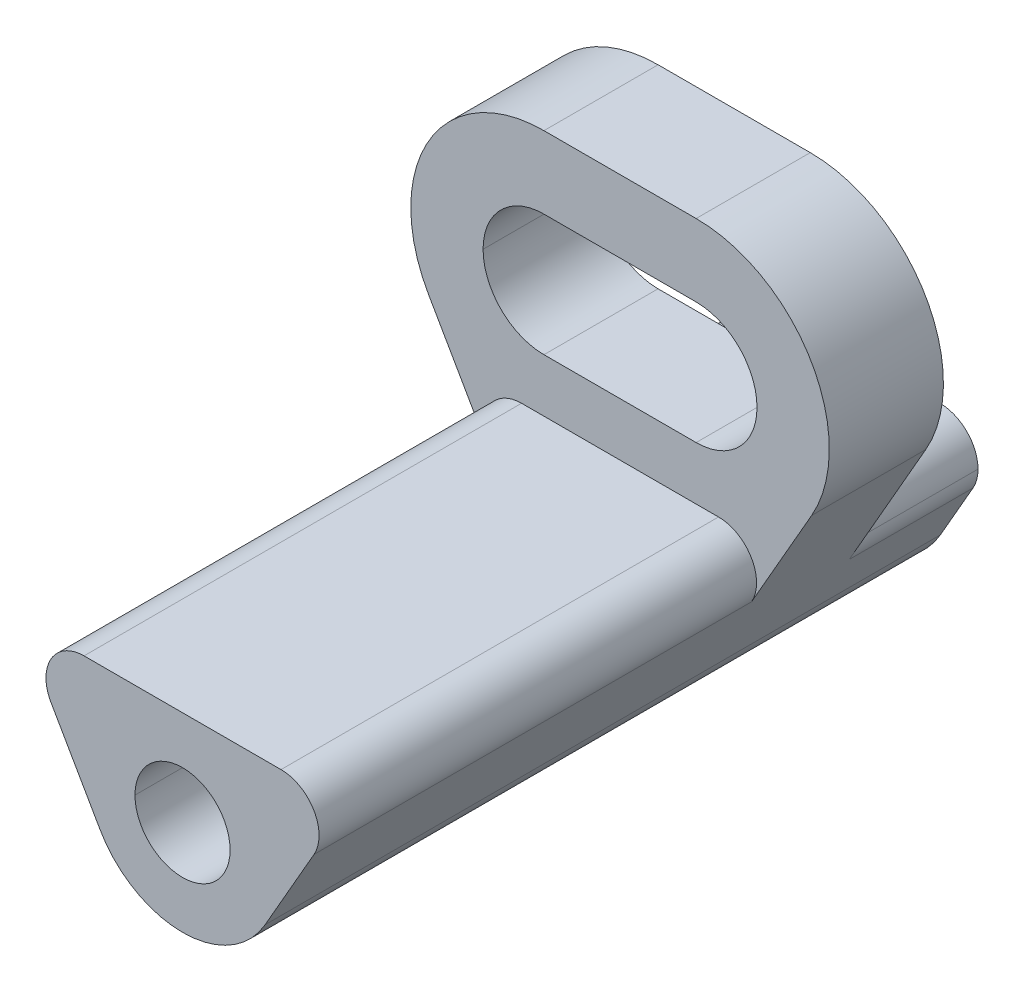
ISO-10303-21;
HEADER;
FILE_DESCRIPTION(('STEP AP214'),'2;1');
FILE_NAME('part.step','',(''),(''),'','','');
FILE_SCHEMA(('AUTOMOTIVE_DESIGN { 1 0 10303 214 1 1 1 1 }'));
ENDSEC;
DATA;
#1=APPLICATION_CONTEXT('core data for automotive mechanical design processes');
#2=APPLICATION_PROTOCOL_DEFINITION('international standard','automotive_design',2000,#1);
#3=PRODUCT_CONTEXT('',#1,'mechanical');
#4=PRODUCT('Part','Part','',(#3));
#5=PRODUCT_RELATED_PRODUCT_CATEGORY('part','',(#4));
#6=PRODUCT_DEFINITION_FORMATION('','',#4);
#7=PRODUCT_DEFINITION_CONTEXT('part definition',#1,'design');
#8=PRODUCT_DEFINITION('design','',#6,#7);
#9=PRODUCT_DEFINITION_SHAPE('','',#8);
#10=(LENGTH_UNIT() NAMED_UNIT(*) SI_UNIT(.MILLI.,.METRE.));
#11=(NAMED_UNIT(*) PLANE_ANGLE_UNIT() SI_UNIT($,.RADIAN.));
#12=(NAMED_UNIT(*) SI_UNIT($,.STERADIAN.) SOLID_ANGLE_UNIT());
#13=UNCERTAINTY_MEASURE_WITH_UNIT(LENGTH_MEASURE(1.E-05),#10,'distance_accuracy_value','');
#14=(GEOMETRIC_REPRESENTATION_CONTEXT(3) GLOBAL_UNCERTAINTY_ASSIGNED_CONTEXT((#13)) GLOBAL_UNIT_ASSIGNED_CONTEXT((#10,
#11,#12)) REPRESENTATION_CONTEXT('',''));
#15=CARTESIAN_POINT('',(0.,0.,0.));
#16=DIRECTION('',(0.,0.,1.));
#17=DIRECTION('',(1.,0.,0.));
#18=AXIS2_PLACEMENT_3D('',#15,#16,#17);
#19=CARTESIAN_POINT('',(-2.58876043244513,-4.,14.8594656094459));
#20=DIRECTION('',(0.,0.,-1.));
#21=DIRECTION('',(-1.,0.,0.));
#22=AXIS2_PLACEMENT_3D('',#19,#20,#21);
#23=CYLINDRICAL_SURFACE('',#22,1.);
#24=CARTESIAN_POINT('',(-2.58876043244513,-4.,14.5));
#25=DIRECTION('',(0.,0.,1.));
#26=DIRECTION('',(1.,0.,0.));
#27=AXIS2_PLACEMENT_3D('',#24,#25,#26);
#28=CIRCLE('',#27,1.);
#29=CARTESIAN_POINT('',(-3.58876043244513,-4.,14.5));
#30=VERTEX_POINT('',#29);
#31=CARTESIAN_POINT('',(-3.45633845099534,-4.49730109765462,14.5));
#32=VERTEX_POINT('',#31);
#33=EDGE_CURVE('E41',#30,#32,#28,.T.);
#34=ORIENTED_EDGE('',*,*,#33,.F.);
#35=DIRECTION('',(0.,0.,-1.));
#36=VECTOR('',#35,1.);
#37=CARTESIAN_POINT('',(-3.58876043244513,-4.,14.8594656094459));
#38=LINE('',#37,#36);
#39=CARTESIAN_POINT('',(-3.58876043244513,-4.,3.));
#40=VERTEX_POINT('',#39);
#41=EDGE_CURVE('E11',#30,#40,#38,.T.);
#42=ORIENTED_EDGE('',*,*,#41,.T.);
#43=CARTESIAN_POINT('',(-2.58876043244513,-4.,3.));
#44=DIRECTION('',(0.,0.,-1.));
#45=DIRECTION('',(1.,0.,0.));
#46=AXIS2_PLACEMENT_3D('',#43,#44,#45);
#47=CIRCLE('',#46,1.);
#48=CARTESIAN_POINT('',(-3.45633845099535,-4.49730109765462,3.));
#49=VERTEX_POINT('',#48);
#50=EDGE_CURVE('E290',#49,#40,#47,.T.);
#51=ORIENTED_EDGE('',*,*,#50,.F.);
#52=DIRECTION('',(0.,0.,-1.));
#53=VECTOR('',#52,1.);
#54=CARTESIAN_POINT('',(-3.45633845099535,-4.49730109765462,14.8594656094459));
#55=LINE('',#54,#53);
#56=EDGE_CURVE('E383',#32,#49,#55,.T.);
#57=ORIENTED_EDGE('',*,*,#56,.F.);
#58=EDGE_LOOP('',(#34,#42,#51,#57));
#59=FACE_BOUND('',#58,.T.);
#60=ADVANCED_FACE('F16',(#59),#23,.T.);
#61=CARTESIAN_POINT('',(2.15885578379551,-4.75,14.8594656094459));
#62=DIRECTION('',(0.,0.,1.));
#63=DIRECTION('',(1.,0.,0.));
#64=AXIS2_PLACEMENT_3D('',#61,#62,#63);
#65=CYLINDRICAL_SURFACE('',#64,1.);
#66=CARTESIAN_POINT('',(2.15885578379551,-4.75,-3.25));
#67=DIRECTION('',(0.,0.,-1.));
#68=DIRECTION('',(-1.,0.,0.));
#69=AXIS2_PLACEMENT_3D('',#66,#67,#68);
#70=CIRCLE('',#69,1.);
#71=CARTESIAN_POINT('',(3.15885578379551,-4.75,-3.25));
#72=VERTEX_POINT('',#71);
#73=CARTESIAN_POINT('',(3.02643380234572,-5.24730109765462,-3.25));
#74=VERTEX_POINT('',#73);
#75=EDGE_CURVE('E343',#72,#74,#70,.T.);
#76=ORIENTED_EDGE('',*,*,#75,.F.);
#77=DIRECTION('',(0.,0.,1.));
#78=VECTOR('',#77,1.);
#79=CARTESIAN_POINT('',(3.15885578379551,-4.75,14.8594656094459));
#80=LINE('',#79,#78);
#81=CARTESIAN_POINT('',(3.15885578379551,-4.75,0.));
#82=VERTEX_POINT('',#81);
#83=EDGE_CURVE('E27',#72,#82,#80,.T.);
#84=ORIENTED_EDGE('',*,*,#83,.T.);
#85=CARTESIAN_POINT('',(2.15885578379551,-4.75,0.));
#86=DIRECTION('',(0.,0.,1.));
#87=DIRECTION('',(1.,0.,0.));
#88=AXIS2_PLACEMENT_3D('',#85,#86,#87);
#89=CIRCLE('',#88,1.);
#90=CARTESIAN_POINT('',(3.02643380234572,-5.24730109765462,0.));
#91=VERTEX_POINT('',#90);
#92=EDGE_CURVE('E292',#91,#82,#89,.T.);
#93=ORIENTED_EDGE('',*,*,#92,.F.);
#94=DIRECTION('',(0.,0.,1.));
#95=VECTOR('',#94,1.);
#96=CARTESIAN_POINT('',(3.02643380234572,-5.24730109765462,14.8594656094459));
#97=LINE('',#96,#95);
#98=EDGE_CURVE('E360',#74,#91,#97,.T.);
#99=ORIENTED_EDGE('',*,*,#98,.F.);
#100=EDGE_LOOP('',(#76,#84,#93,#99));
#101=FACE_BOUND('',#100,.T.);
#102=ADVANCED_FACE('F661',(#101),#65,.T.);
#103=CARTESIAN_POINT('',(0.,-5.5,14.5));
#104=DIRECTION('',(0.,0.,1.));
#105=DIRECTION('',(1.,0.,0.));
#106=AXIS2_PLACEMENT_3D('',#103,#104,#105);
#107=CYLINDRICAL_SURFACE('',#106,1.25);
#108=CARTESIAN_POINT('',(0.,-5.5,7.));
#109=DIRECTION('',(0.,0.,1.));
#110=DIRECTION('',(1.,0.,0.));
#111=AXIS2_PLACEMENT_3D('',#108,#109,#110);
#112=CIRCLE('',#111,1.25);
#113=CARTESIAN_POINT('',(-1.25,-5.5,7.));
#114=VERTEX_POINT('',#113);
#115=CARTESIAN_POINT('',(1.25,-5.5,7.));
#116=VERTEX_POINT('',#115);
#117=EDGE_CURVE('E267',#114,#116,#112,.T.);
#118=ORIENTED_EDGE('',*,*,#117,.F.);
#119=DIRECTION('',(0.,0.,1.));
#120=VECTOR('',#119,1.);
#121=CARTESIAN_POINT('',(-1.25,-5.5,14.5));
#122=LINE('',#121,#120);
#123=CARTESIAN_POINT('',(-1.25,-5.5,14.5));
#124=VERTEX_POINT('',#123);
#125=EDGE_CURVE('E272',#114,#124,#122,.T.);
#126=ORIENTED_EDGE('',*,*,#125,.T.);
#127=CARTESIAN_POINT('',(0.,-5.5,14.5));
#128=DIRECTION('',(0.,0.,1.));
#129=DIRECTION('',(1.,0.,0.));
#130=AXIS2_PLACEMENT_3D('',#127,#128,#129);
#131=CIRCLE('',#130,1.25);
#132=CARTESIAN_POINT('',(1.25,-5.5,14.5));
#133=VERTEX_POINT('',#132);
#134=EDGE_CURVE('E275',#124,#133,#131,.T.);
#135=ORIENTED_EDGE('',*,*,#134,.T.);
#136=DIRECTION('',(0.,0.,1.));
#137=VECTOR('',#136,1.);
#138=CARTESIAN_POINT('',(1.25,-5.5,14.5));
#139=LINE('',#138,#137);
#140=EDGE_CURVE('E436',#116,#133,#139,.T.);
#141=ORIENTED_EDGE('',*,*,#140,.F.);
#142=EDGE_LOOP('',(#118,#126,#135,#141));
#143=FACE_BOUND('',#142,.T.);
#144=ADVANCED_FACE('F656',(#143),#107,.F.);
#145=CARTESIAN_POINT('',(0.,-5.5,7.));
#146=DIRECTION('',(0.,0.,1.));
#147=DIRECTION('',(1.,0.,0.));
#148=AXIS2_PLACEMENT_3D('',#145,#146,#147);
#149=CONICAL_SURFACE('',#148,1.25,1.02974425867665);
#150=DIRECTION('',(0.857167300702112,0.,0.515038074910055));
#151=VECTOR('',#150,1.);
#152=CARTESIAN_POINT('',(1.25,-5.5,7.));
#153=LINE('',#152,#151);
#154=CARTESIAN_POINT('',(0.,-5.5,6.24892422621555));
#155=VERTEX_POINT('',#154);
#156=EDGE_CURVE('E335',#155,#116,#153,.T.);
#157=ORIENTED_EDGE('',*,*,#156,.F.);
#158=DIRECTION('',(-0.857167300702112,0.,0.515038074910055));
#159=VECTOR('',#158,1.);
#160=CARTESIAN_POINT('',(-1.25,-5.5,7.));
#161=LINE('',#160,#159);
#162=EDGE_CURVE('E270',#155,#114,#161,.T.);
#163=ORIENTED_EDGE('',*,*,#162,.T.);
#164=ORIENTED_EDGE('',*,*,#117,.T.);
#165=EDGE_LOOP('',(#157,#163,#164));
#166=FACE_BOUND('',#165,.T.);
#167=ADVANCED_FACE('F660',(#166),#149,.F.);
#168=CARTESIAN_POINT('',(-2.,0.,3.));
#169=DIRECTION('',(0.,0.,-1.));
#170=DIRECTION('',(-1.,0.,0.));
#171=AXIS2_PLACEMENT_3D('',#168,#169,#170);
#172=CYLINDRICAL_SURFACE('',#171,1.6);
#173=CARTESIAN_POINT('',(-2.,0.,3.));
#174=DIRECTION('',(0.,0.,1.));
#175=DIRECTION('',(1.,0.,0.));
#176=AXIS2_PLACEMENT_3D('',#173,#174,#175);
#177=CIRCLE('',#176,1.6);
#178=CARTESIAN_POINT('',(-2.,1.6,3.));
#179=VERTEX_POINT('',#178);
#180=CARTESIAN_POINT('',(-3.6,0.,3.));
#181=VERTEX_POINT('',#180);
#182=EDGE_CURVE('E271',#179,#181,#177,.T.);
#183=ORIENTED_EDGE('',*,*,#182,.T.);
#184=DIRECTION('',(0.,0.,-1.));
#185=VECTOR('',#184,1.);
#186=CARTESIAN_POINT('',(-3.6,0.,3.));
#187=LINE('',#186,#185);
#188=CARTESIAN_POINT('',(-3.6,0.,0.));
#189=VERTEX_POINT('',#188);
#190=EDGE_CURVE('E309',#181,#189,#187,.T.);
#191=ORIENTED_EDGE('',*,*,#190,.T.);
#192=CARTESIAN_POINT('',(-2.,0.,0.));
#193=DIRECTION('',(0.,0.,1.));
#194=DIRECTION('',(1.,0.,0.));
#195=AXIS2_PLACEMENT_3D('',#192,#193,#194);
#196=CIRCLE('',#195,1.6);
#197=CARTESIAN_POINT('',(-2.,1.6,0.));
#198=VERTEX_POINT('',#197);
#199=EDGE_CURVE('E348',#198,#189,#196,.T.);
#200=ORIENTED_EDGE('',*,*,#199,.F.);
#201=DIRECTION('',(0.,0.,-1.));
#202=VECTOR('',#201,1.);
#203=CARTESIAN_POINT('',(-2.,1.6,3.));
#204=LINE('',#203,#202);
#205=EDGE_CURVE('E402',#179,#198,#204,.T.);
#206=ORIENTED_EDGE('',*,*,#205,.F.);
#207=EDGE_LOOP('',(#183,#191,#200,#206));
#208=FACE_BOUND('',#207,.T.);
#209=ADVANCED_FACE('F808',(#208),#172,.F.);
#210=CARTESIAN_POINT('',(-2.,0.,3.));
#211=DIRECTION('',(0.,0.,-1.));
#212=DIRECTION('',(-1.,0.,0.));
#213=AXIS2_PLACEMENT_3D('',#210,#211,#212);
#214=CYLINDRICAL_SURFACE('',#213,3.5);
#215=CARTESIAN_POINT('',(-2.,0.,3.));
#216=DIRECTION('',(0.,0.,1.));
#217=DIRECTION('',(1.,0.,0.));
#218=AXIS2_PLACEMENT_3D('',#215,#216,#217);
#219=CIRCLE('',#218,3.5);
#220=CARTESIAN_POINT('',(-5.5,0.,3.));
#221=VERTEX_POINT('',#220);
#222=CARTESIAN_POINT('',(-5.03652306492573,-1.74055384179118,3.));
#223=VERTEX_POINT('',#222);
#224=EDGE_CURVE('E302',#221,#223,#219,.T.);
#225=ORIENTED_EDGE('',*,*,#224,.F.);
#226=DIRECTION('',(0.,0.,-1.));
#227=VECTOR('',#226,1.);
#228=CARTESIAN_POINT('',(-5.5,0.,3.));
#229=LINE('',#228,#227);
#230=CARTESIAN_POINT('',(-5.5,0.,0.));
#231=VERTEX_POINT('',#230);
#232=EDGE_CURVE('E313',#221,#231,#229,.T.);
#233=ORIENTED_EDGE('',*,*,#232,.T.);
#234=CARTESIAN_POINT('',(-2.,0.,0.));
#235=DIRECTION('',(0.,0.,1.));
#236=DIRECTION('',(1.,0.,0.));
#237=AXIS2_PLACEMENT_3D('',#234,#235,#236);
#238=CIRCLE('',#237,3.5);
#239=CARTESIAN_POINT('',(-5.03652306492573,-1.74055384179118,0.));
#240=VERTEX_POINT('',#239);
#241=EDGE_CURVE('E371',#231,#240,#238,.T.);
#242=ORIENTED_EDGE('',*,*,#241,.T.);
#243=DIRECTION('',(0.,0.,-1.));
#244=VECTOR('',#243,1.);
#245=CARTESIAN_POINT('',(-5.03652306492573,-1.74055384179118,14.8594656094459));
#246=LINE('',#245,#244);
#247=EDGE_CURVE('E100',#223,#240,#246,.T.);
#248=ORIENTED_EDGE('',*,*,#247,.F.);
#249=EDGE_LOOP('',(#225,#233,#242,#248));
#250=FACE_BOUND('',#249,.T.);
#251=ADVANCED_FACE('F509',(#250),#214,.T.);
#252=CARTESIAN_POINT('',(-2.,0.,0.));
#253=DIRECTION('',(0.,0.,1.));
#254=DIRECTION('',(1.,0.,0.));
#255=AXIS2_PLACEMENT_3D('',#252,#253,#254);
#256=PLANE('',#255);
#257=DIRECTION('',(1.,0.,0.));
#258=VECTOR('',#257,1.);
#259=CARTESIAN_POINT('',(3.88469607209226,-3.75,0.));
#260=LINE('',#259,#258);
#261=CARTESIAN_POINT('',(-2.1588557837955,-3.75,0.));
#262=VERTEX_POINT('',#261);
#263=CARTESIAN_POINT('',(2.15885578379551,-3.75,0.));
#264=VERTEX_POINT('',#263);
#265=EDGE_CURVE('E116',#262,#264,#260,.T.);
#266=ORIENTED_EDGE('',*,*,#265,.F.);
#267=CARTESIAN_POINT('',(-2.1588557837955,-4.75,0.));
#268=DIRECTION('',(0.,0.,1.));
#269=DIRECTION('',(1.,0.,0.));
#270=AXIS2_PLACEMENT_3D('',#267,#268,#269);
#271=CIRCLE('',#270,1.);
#272=CARTESIAN_POINT('',(-3.02643380234572,-5.24730109765462,0.));
#273=VERTEX_POINT('',#272);
#274=EDGE_CURVE('E296',#262,#273,#271,.T.);
#275=ORIENTED_EDGE('',*,*,#274,.T.);
#276=DIRECTION('',(0.497301097654622,-0.86757801855021,0.));
#277=VECTOR('',#276,1.);
#278=CARTESIAN_POINT('',(-2.16894504637553,-6.74325274413655,0.));
#279=LINE('',#278,#277);
#280=EDGE_CURVE('E391',#240,#273,#279,.T.);
#281=ORIENTED_EDGE('',*,*,#280,.F.);
#282=ORIENTED_EDGE('',*,*,#241,.F.);
#283=CARTESIAN_POINT('',(-2.,0.,0.));
#284=DIRECTION('',(0.,0.,1.));
#285=DIRECTION('',(1.,0.,0.));
#286=AXIS2_PLACEMENT_3D('',#283,#284,#285);
#287=CIRCLE('',#286,3.5);
#288=CARTESIAN_POINT('',(-2.,3.5,0.));
#289=VERTEX_POINT('',#288);
#290=EDGE_CURVE('E285',#289,#231,#287,.T.);
#291=ORIENTED_EDGE('',*,*,#290,.F.);
#292=DIRECTION('',(-1.,0.,0.));
#293=VECTOR('',#292,1.);
#294=CARTESIAN_POINT('',(-2.,3.5,0.));
#295=LINE('',#294,#293);
#296=CARTESIAN_POINT('',(2.,3.5,0.));
#297=VERTEX_POINT('',#296);
#298=EDGE_CURVE('E136',#297,#289,#295,.T.);
#299=ORIENTED_EDGE('',*,*,#298,.F.);
#300=CARTESIAN_POINT('',(2.,0.,0.));
#301=DIRECTION('',(0.,0.,1.));
#302=DIRECTION('',(1.,0.,0.));
#303=AXIS2_PLACEMENT_3D('',#300,#301,#302);
#304=CIRCLE('',#303,3.5);
#305=CARTESIAN_POINT('',(5.03652306492573,-1.74055384179118,0.));
#306=VERTEX_POINT('',#305);
#307=EDGE_CURVE('E250',#306,#297,#304,.T.);
#308=ORIENTED_EDGE('',*,*,#307,.F.);
#309=DIRECTION('',(0.497301097654622,0.86757801855021,0.));
#310=VECTOR('',#309,1.);
#311=CARTESIAN_POINT('',(5.03652306492573,-1.74055384179118,0.));
#312=LINE('',#311,#310);
#313=EDGE_CURVE('E152',#91,#306,#312,.T.);
#314=ORIENTED_EDGE('',*,*,#313,.F.);
#315=ORIENTED_EDGE('',*,*,#92,.T.);
#316=CARTESIAN_POINT('',(2.15885578379551,-4.75,0.));
#317=DIRECTION('',(0.,0.,1.));
#318=DIRECTION('',(1.,0.,0.));
#319=AXIS2_PLACEMENT_3D('',#316,#317,#318);
#320=CIRCLE('',#319,1.);
#321=EDGE_CURVE('E297',#82,#264,#320,.T.);
#322=ORIENTED_EDGE('',*,*,#321,.T.);
#323=EDGE_LOOP('',(#266,#275,#281,#282,#291,#299,#308,#314,#315,#322));
#324=FACE_BOUND('',#323,.T.);
#325=CARTESIAN_POINT('',(2.,0.,0.));
#326=DIRECTION('',(0.,0.,1.));
#327=DIRECTION('',(1.,0.,0.));
#328=AXIS2_PLACEMENT_3D('',#325,#326,#327);
#329=CIRCLE('',#328,1.6);
#330=CARTESIAN_POINT('',(2.,-1.6,0.));
#331=VERTEX_POINT('',#330);
#332=CARTESIAN_POINT('',(2.,1.6,0.));
#333=VERTEX_POINT('',#332);
#334=EDGE_CURVE('E445',#331,#333,#329,.T.);
#335=ORIENTED_EDGE('',*,*,#334,.T.);
#336=DIRECTION('',(-1.,0.,0.));
#337=VECTOR('',#336,1.);
#338=CARTESIAN_POINT('',(2.,1.6,0.));
#339=LINE('',#338,#337);
#340=EDGE_CURVE('E351',#333,#198,#339,.T.);
#341=ORIENTED_EDGE('',*,*,#340,.T.);
#342=ORIENTED_EDGE('',*,*,#199,.T.);
#343=CARTESIAN_POINT('',(-2.,0.,0.));
#344=DIRECTION('',(0.,0.,1.));
#345=DIRECTION('',(1.,0.,0.));
#346=AXIS2_PLACEMENT_3D('',#343,#344,#345);
#347=CIRCLE('',#346,1.6);
#348=CARTESIAN_POINT('',(-2.,-1.6,0.));
#349=VERTEX_POINT('',#348);
#350=EDGE_CURVE('E352',#189,#349,#347,.T.);
#351=ORIENTED_EDGE('',*,*,#350,.T.);
#352=DIRECTION('',(1.,0.,0.));
#353=VECTOR('',#352,1.);
#354=CARTESIAN_POINT('',(2.,-1.6,0.));
#355=LINE('',#354,#353);
#356=EDGE_CURVE('E284',#349,#331,#355,.T.);
#357=ORIENTED_EDGE('',*,*,#356,.T.);
#358=EDGE_LOOP('',(#335,#341,#342,#351,#357));
#359=FACE_BOUND('',#358,.T.);
#360=ADVANCED_FACE('F478',(#324,#359),#256,.F.);
#361=CARTESIAN_POINT('',(-2.,0.,3.));
#362=DIRECTION('',(0.,0.,-1.));
#363=DIRECTION('',(-1.,0.,0.));
#364=AXIS2_PLACEMENT_3D('',#361,#362,#363);
#365=CYLINDRICAL_SURFACE('',#364,3.5);
#366=ORIENTED_EDGE('',*,*,#232,.F.);
#367=CARTESIAN_POINT('',(-2.,0.,3.));
#368=DIRECTION('',(0.,0.,1.));
#369=DIRECTION('',(1.,0.,0.));
#370=AXIS2_PLACEMENT_3D('',#367,#368,#369);
#371=CIRCLE('',#370,3.5);
#372=CARTESIAN_POINT('',(-2.,3.5,3.));
#373=VERTEX_POINT('',#372);
#374=EDGE_CURVE('E239',#373,#221,#371,.T.);
#375=ORIENTED_EDGE('',*,*,#374,.F.);
#376=DIRECTION('',(0.,0.,-1.));
#377=VECTOR('',#376,1.);
#378=CARTESIAN_POINT('',(-2.,3.5,3.));
#379=LINE('',#378,#377);
#380=EDGE_CURVE('E234',#373,#289,#379,.T.);
#381=ORIENTED_EDGE('',*,*,#380,.T.);
#382=ORIENTED_EDGE('',*,*,#290,.T.);
#383=EDGE_LOOP('',(#366,#375,#381,#382));
#384=FACE_BOUND('',#383,.T.);
#385=ADVANCED_FACE('F511',(#384),#365,.T.);
#386=CARTESIAN_POINT('',(-2.,0.,3.));
#387=DIRECTION('',(0.,0.,1.));
#388=DIRECTION('',(1.,0.,0.));
#389=AXIS2_PLACEMENT_3D('',#386,#387,#388);
#390=PLANE('',#389);
#391=DIRECTION('',(-1.,0.,0.));
#392=VECTOR('',#391,1.);
#393=CARTESIAN_POINT('',(-4.31460072074188,-3.,3.));
#394=LINE('',#393,#392);
#395=CARTESIAN_POINT('',(2.58876043244513,-3.,3.));
#396=VERTEX_POINT('',#395);
#397=CARTESIAN_POINT('',(-2.58876043244513,-3.,3.));
#398=VERTEX_POINT('',#397);
#399=EDGE_CURVE('E307',#396,#398,#394,.T.);
#400=ORIENTED_EDGE('',*,*,#399,.F.);
#401=CARTESIAN_POINT('',(2.58876043244513,-4.,3.));
#402=DIRECTION('',(0.,0.,-1.));
#403=DIRECTION('',(1.,0.,0.));
#404=AXIS2_PLACEMENT_3D('',#401,#402,#403);
#405=CIRCLE('',#404,1.);
#406=CARTESIAN_POINT('',(3.45633845099535,-4.49730109765462,3.));
#407=VERTEX_POINT('',#406);
#408=EDGE_CURVE('E462',#396,#407,#405,.T.);
#409=ORIENTED_EDGE('',*,*,#408,.T.);
#410=DIRECTION('',(0.497301097654622,0.86757801855021,0.));
#411=VECTOR('',#410,1.);
#412=CARTESIAN_POINT('',(5.03652306492573,-1.74055384179118,3.));
#413=LINE('',#412,#411);
#414=CARTESIAN_POINT('',(5.03652306492573,-1.74055384179118,3.));
#415=VERTEX_POINT('',#414);
#416=EDGE_CURVE('E244',#407,#415,#413,.T.);
#417=ORIENTED_EDGE('',*,*,#416,.T.);
#418=CARTESIAN_POINT('',(2.,0.,3.));
#419=DIRECTION('',(0.,0.,1.));
#420=DIRECTION('',(1.,0.,0.));
#421=AXIS2_PLACEMENT_3D('',#418,#419,#420);
#422=CIRCLE('',#421,3.5);
#423=CARTESIAN_POINT('',(2.,3.5,3.));
#424=VERTEX_POINT('',#423);
#425=EDGE_CURVE('E238',#415,#424,#422,.T.);
#426=ORIENTED_EDGE('',*,*,#425,.T.);
#427=DIRECTION('',(-1.,0.,0.));
#428=VECTOR('',#427,1.);
#429=CARTESIAN_POINT('',(-2.,3.5,3.));
#430=LINE('',#429,#428);
#431=EDGE_CURVE('E228',#424,#373,#430,.T.);
#432=ORIENTED_EDGE('',*,*,#431,.T.);
#433=ORIENTED_EDGE('',*,*,#374,.T.);
#434=ORIENTED_EDGE('',*,*,#224,.T.);
#435=DIRECTION('',(0.497301097654622,-0.86757801855021,0.));
#436=VECTOR('',#435,1.);
#437=CARTESIAN_POINT('',(-2.16894504637553,-6.74325274413655,3.));
#438=LINE('',#437,#436);
#439=EDGE_CURVE('E298',#223,#49,#438,.T.);
#440=ORIENTED_EDGE('',*,*,#439,.T.);
#441=ORIENTED_EDGE('',*,*,#50,.T.);
#442=CARTESIAN_POINT('',(-2.58876043244513,-4.,3.));
#443=DIRECTION('',(0.,0.,-1.));
#444=DIRECTION('',(1.,0.,0.));
#445=AXIS2_PLACEMENT_3D('',#442,#443,#444);
#446=CIRCLE('',#445,1.);
#447=EDGE_CURVE('E286',#40,#398,#446,.T.);
#448=ORIENTED_EDGE('',*,*,#447,.T.);
#449=EDGE_LOOP('',(#400,#409,#417,#426,#432,#433,#434,#440,#441,#448));
#450=FACE_BOUND('',#449,.T.);
#451=DIRECTION('',(-1.,0.,0.));
#452=VECTOR('',#451,1.);
#453=CARTESIAN_POINT('',(2.,1.6,3.));
#454=LINE('',#453,#452);
#455=CARTESIAN_POINT('',(2.,1.6,3.));
#456=VERTEX_POINT('',#455);
#457=EDGE_CURVE('E398',#456,#179,#454,.T.);
#458=ORIENTED_EDGE('',*,*,#457,.F.);
#459=CARTESIAN_POINT('',(2.,0.,3.));
#460=DIRECTION('',(0.,0.,1.));
#461=DIRECTION('',(1.,0.,0.));
#462=AXIS2_PLACEMENT_3D('',#459,#460,#461);
#463=CIRCLE('',#462,1.6);
#464=CARTESIAN_POINT('',(2.,-1.6,3.));
#465=VERTEX_POINT('',#464);
#466=EDGE_CURVE('E252',#465,#456,#463,.T.);
#467=ORIENTED_EDGE('',*,*,#466,.F.);
#468=DIRECTION('',(1.,0.,0.));
#469=VECTOR('',#468,1.);
#470=CARTESIAN_POINT('',(2.,-1.6,3.));
#471=LINE('',#470,#469);
#472=CARTESIAN_POINT('',(-2.,-1.6,3.));
#473=VERTEX_POINT('',#472);
#474=EDGE_CURVE('E334',#473,#465,#471,.T.);
#475=ORIENTED_EDGE('',*,*,#474,.F.);
#476=CARTESIAN_POINT('',(-2.,0.,3.));
#477=DIRECTION('',(0.,0.,1.));
#478=DIRECTION('',(1.,0.,0.));
#479=AXIS2_PLACEMENT_3D('',#476,#477,#478);
#480=CIRCLE('',#479,1.6);
#481=EDGE_CURVE('E333',#181,#473,#480,.T.);
#482=ORIENTED_EDGE('',*,*,#481,.F.);
#483=ORIENTED_EDGE('',*,*,#182,.F.);
#484=EDGE_LOOP('',(#458,#467,#475,#482,#483));
#485=FACE_BOUND('',#484,.T.);
#486=ADVANCED_FACE('F18',(#450,#485),#390,.T.);
#487=CARTESIAN_POINT('',(2.,0.,3.));
#488=DIRECTION('',(0.,0.,-1.));
#489=DIRECTION('',(-1.,0.,0.));
#490=AXIS2_PLACEMENT_3D('',#487,#488,#489);
#491=CYLINDRICAL_SURFACE('',#490,3.5);
#492=ORIENTED_EDGE('',*,*,#425,.F.);
#493=DIRECTION('',(0.,0.,-1.));
#494=VECTOR('',#493,1.);
#495=CARTESIAN_POINT('',(5.03652306492573,-1.74055384179118,14.8594656094459));
#496=LINE('',#495,#494);
#497=EDGE_CURVE('E291',#415,#306,#496,.T.);
#498=ORIENTED_EDGE('',*,*,#497,.T.);
#499=ORIENTED_EDGE('',*,*,#307,.T.);
#500=DIRECTION('',(0.,0.,-1.));
#501=VECTOR('',#500,1.);
#502=CARTESIAN_POINT('',(2.,3.5,3.));
#503=LINE('',#502,#501);
#504=EDGE_CURVE('E232',#424,#297,#503,.T.);
#505=ORIENTED_EDGE('',*,*,#504,.F.);
#506=EDGE_LOOP('',(#492,#498,#499,#505));
#507=FACE_BOUND('',#506,.T.);
#508=ADVANCED_FACE('F249',(#507),#491,.T.);
#509=CARTESIAN_POINT('',(-2.,3.5,3.));
#510=DIRECTION('',(0.,-1.,0.));
#511=DIRECTION('',(0.,0.,-1.));
#512=AXIS2_PLACEMENT_3D('',#509,#510,#511);
#513=PLANE('',#512);
#514=ORIENTED_EDGE('',*,*,#298,.T.);
#515=ORIENTED_EDGE('',*,*,#380,.F.);
#516=ORIENTED_EDGE('',*,*,#431,.F.);
#517=ORIENTED_EDGE('',*,*,#504,.T.);
#518=EDGE_LOOP('',(#514,#515,#516,#517));
#519=FACE_BOUND('',#518,.T.);
#520=ADVANCED_FACE('F230',(#519),#513,.F.);
#521=CARTESIAN_POINT('',(2.,0.,3.));
#522=DIRECTION('',(0.,0.,-1.));
#523=DIRECTION('',(-1.,0.,0.));
#524=AXIS2_PLACEMENT_3D('',#521,#522,#523);
#525=CYLINDRICAL_SURFACE('',#524,1.6);
#526=ORIENTED_EDGE('',*,*,#334,.F.);
#527=DIRECTION('',(0.,0.,-1.));
#528=VECTOR('',#527,1.);
#529=CARTESIAN_POINT('',(2.,-1.6,3.));
#530=LINE('',#529,#528);
#531=EDGE_CURVE('E456',#465,#331,#530,.T.);
#532=ORIENTED_EDGE('',*,*,#531,.F.);
#533=ORIENTED_EDGE('',*,*,#466,.T.);
#534=DIRECTION('',(0.,0.,-1.));
#535=VECTOR('',#534,1.);
#536=CARTESIAN_POINT('',(2.,1.6,3.));
#537=LINE('',#536,#535);
#538=EDGE_CURVE('E262',#456,#333,#537,.T.);
#539=ORIENTED_EDGE('',*,*,#538,.T.);
#540=EDGE_LOOP('',(#526,#532,#533,#539));
#541=FACE_BOUND('',#540,.T.);
#542=ADVANCED_FACE('F672',(#541),#525,.F.);
#543=CARTESIAN_POINT('',(2.,1.6,3.));
#544=DIRECTION('',(0.,-1.,0.));
#545=DIRECTION('',(0.,0.,-1.));
#546=AXIS2_PLACEMENT_3D('',#543,#544,#545);
#547=PLANE('',#546);
#548=ORIENTED_EDGE('',*,*,#340,.F.);
#549=ORIENTED_EDGE('',*,*,#538,.F.);
#550=ORIENTED_EDGE('',*,*,#457,.T.);
#551=ORIENTED_EDGE('',*,*,#205,.T.);
#552=EDGE_LOOP('',(#548,#549,#550,#551));
#553=FACE_BOUND('',#552,.T.);
#554=ADVANCED_FACE('F667',(#553),#547,.T.);
#555=CARTESIAN_POINT('',(-2.,0.,3.));
#556=DIRECTION('',(0.,0.,-1.));
#557=DIRECTION('',(-1.,0.,0.));
#558=AXIS2_PLACEMENT_3D('',#555,#556,#557);
#559=CYLINDRICAL_SURFACE('',#558,1.6);
#560=ORIENTED_EDGE('',*,*,#190,.F.);
#561=ORIENTED_EDGE('',*,*,#481,.T.);
#562=DIRECTION('',(0.,0.,-1.));
#563=VECTOR('',#562,1.);
#564=CARTESIAN_POINT('',(-2.,-1.6,3.));
#565=LINE('',#564,#563);
#566=EDGE_CURVE('E329',#473,#349,#565,.T.);
#567=ORIENTED_EDGE('',*,*,#566,.T.);
#568=ORIENTED_EDGE('',*,*,#350,.F.);
#569=EDGE_LOOP('',(#560,#561,#567,#568));
#570=FACE_BOUND('',#569,.T.);
#571=ADVANCED_FACE('F671',(#570),#559,.F.);
#572=CARTESIAN_POINT('',(2.,-1.6,3.));
#573=DIRECTION('',(0.,1.,0.));
#574=DIRECTION('',(1.,0.,0.));
#575=AXIS2_PLACEMENT_3D('',#572,#573,#574);
#576=PLANE('',#575);
#577=ORIENTED_EDGE('',*,*,#356,.F.);
#578=ORIENTED_EDGE('',*,*,#566,.F.);
#579=ORIENTED_EDGE('',*,*,#474,.T.);
#580=ORIENTED_EDGE('',*,*,#531,.T.);
#581=EDGE_LOOP('',(#577,#578,#579,#580));
#582=FACE_BOUND('',#581,.T.);
#583=ADVANCED_FACE('F698',(#582),#576,.T.);
#584=CARTESIAN_POINT('',(-2.16894504637553,-6.74325274413655,14.8594656094459));
#585=DIRECTION('',(0.86757801855021,0.497301097654622,0.));
#586=DIRECTION('',(0.,0.,-1.));
#587=AXIS2_PLACEMENT_3D('',#584,#585,#586);
#588=PLANE('',#587);
#589=ORIENTED_EDGE('',*,*,#280,.T.);
#590=DIRECTION('',(0.,0.,-1.));
#591=VECTOR('',#590,1.);
#592=CARTESIAN_POINT('',(-3.02643380234572,-5.24730109765462,14.8594656094459));
#593=LINE('',#592,#591);
#594=CARTESIAN_POINT('',(-3.02643380234572,-5.24730109765462,-3.25));
#595=VERTEX_POINT('',#594);
#596=EDGE_CURVE('E387',#273,#595,#593,.T.);
#597=ORIENTED_EDGE('',*,*,#596,.T.);
#598=DIRECTION('',(-0.497301097654622,0.86757801855021,0.));
#599=VECTOR('',#598,1.);
#600=CARTESIAN_POINT('',(-3.88469607209226,-3.75,-3.25));
#601=LINE('',#600,#599);
#602=CARTESIAN_POINT('',(-2.16894504637553,-6.74325274413655,-3.25));
#603=VERTEX_POINT('',#602);
#604=EDGE_CURVE('E359',#603,#595,#601,.T.);
#605=ORIENTED_EDGE('',*,*,#604,.F.);
#606=DIRECTION('',(0.,0.,-1.));
#607=VECTOR('',#606,1.);
#608=CARTESIAN_POINT('',(-2.16894504637553,-6.74325274413655,14.8594656094459));
#609=LINE('',#608,#607);
#610=CARTESIAN_POINT('',(-2.16894504637553,-6.74325274413655,14.5));
#611=VERTEX_POINT('',#610);
#612=EDGE_CURVE('E363',#611,#603,#609,.T.);
#613=ORIENTED_EDGE('',*,*,#612,.F.);
#614=DIRECTION('',(0.497301097654622,-0.86757801855021,0.));
#615=VECTOR('',#614,1.);
#616=CARTESIAN_POINT('',(-4.31460072074188,-3.,14.5));
#617=LINE('',#616,#615);
#618=EDGE_CURVE('E328',#32,#611,#617,.T.);
#619=ORIENTED_EDGE('',*,*,#618,.F.);
#620=ORIENTED_EDGE('',*,*,#56,.T.);
#621=ORIENTED_EDGE('',*,*,#439,.F.);
#622=ORIENTED_EDGE('',*,*,#247,.T.);
#623=EDGE_LOOP('',(#589,#597,#605,#613,#619,#620,#621,#622));
#624=FACE_BOUND('',#623,.T.);
#625=ADVANCED_FACE('F504',(#624),#588,.F.);
#626=CARTESIAN_POINT('',(0.,-5.5,14.8594656094459));
#627=DIRECTION('',(0.,0.,-1.));
#628=DIRECTION('',(-1.,0.,0.));
#629=AXIS2_PLACEMENT_3D('',#626,#627,#628);
#630=CYLINDRICAL_SURFACE('',#629,2.5);
#631=DIRECTION('',(0.,0.,-1.));
#632=VECTOR('',#631,1.);
#633=CARTESIAN_POINT('',(2.16894504637553,-6.74325274413655,14.8594656094459));
#634=LINE('',#633,#632);
#635=CARTESIAN_POINT('',(2.16894504637553,-6.74325274413655,14.5));
#636=VERTEX_POINT('',#635);
#637=CARTESIAN_POINT('',(2.16894504637553,-6.74325274413655,-3.25));
#638=VERTEX_POINT('',#637);
#639=EDGE_CURVE('E280',#636,#638,#634,.T.);
#640=ORIENTED_EDGE('',*,*,#639,.F.);
#641=CARTESIAN_POINT('',(0.,-5.5,14.5));
#642=DIRECTION('',(0.,0.,1.));
#643=DIRECTION('',(1.,0.,0.));
#644=AXIS2_PLACEMENT_3D('',#641,#642,#643);
#645=CIRCLE('',#644,2.5);
#646=EDGE_CURVE('E339',#611,#636,#645,.T.);
#647=ORIENTED_EDGE('',*,*,#646,.F.);
#648=ORIENTED_EDGE('',*,*,#612,.T.);
#649=CARTESIAN_POINT('',(0.,-5.5,-3.25));
#650=DIRECTION('',(0.,0.,-1.));
#651=DIRECTION('',(-1.,0.,0.));
#652=AXIS2_PLACEMENT_3D('',#649,#650,#651);
#653=CIRCLE('',#652,2.5);
#654=EDGE_CURVE('E394',#638,#603,#653,.T.);
#655=ORIENTED_EDGE('',*,*,#654,.F.);
#656=EDGE_LOOP('',(#640,#647,#648,#655));
#657=FACE_BOUND('',#656,.T.);
#658=ADVANCED_FACE('F677',(#657),#630,.T.);
#659=CARTESIAN_POINT('',(5.03652306492573,-1.74055384179118,14.8594656094459));
#660=DIRECTION('',(-0.86757801855021,0.497301097654622,0.));
#661=DIRECTION('',(0.,0.,1.));
#662=AXIS2_PLACEMENT_3D('',#659,#660,#661);
#663=PLANE('',#662);
#664=DIRECTION('',(-0.497301097654622,-0.86757801855021,0.));
#665=VECTOR('',#664,1.);
#666=CARTESIAN_POINT('',(2.16894504637553,-6.74325274413655,-3.25));
#667=LINE('',#666,#665);
#668=EDGE_CURVE('E347',#74,#638,#667,.T.);
#669=ORIENTED_EDGE('',*,*,#668,.F.);
#670=ORIENTED_EDGE('',*,*,#98,.T.);
#671=ORIENTED_EDGE('',*,*,#313,.T.);
#672=ORIENTED_EDGE('',*,*,#497,.F.);
#673=ORIENTED_EDGE('',*,*,#416,.F.);
#674=DIRECTION('',(0.,0.,1.));
#675=VECTOR('',#674,1.);
#676=CARTESIAN_POINT('',(3.45633845099535,-4.49730109765462,14.8594656094459));
#677=LINE('',#676,#675);
#678=CARTESIAN_POINT('',(3.45633845099534,-4.49730109765462,14.5));
#679=VERTEX_POINT('',#678);
#680=EDGE_CURVE('E277',#407,#679,#677,.T.);
#681=ORIENTED_EDGE('',*,*,#680,.T.);
#682=DIRECTION('',(0.497301097654622,0.86757801855021,0.));
#683=VECTOR('',#682,1.);
#684=CARTESIAN_POINT('',(2.16894504637553,-6.74325274413655,14.5));
#685=LINE('',#684,#683);
#686=EDGE_CURVE('E308',#636,#679,#685,.T.);
#687=ORIENTED_EDGE('',*,*,#686,.F.);
#688=ORIENTED_EDGE('',*,*,#639,.T.);
#689=EDGE_LOOP('',(#669,#670,#671,#672,#673,#681,#687,#688));
#690=FACE_BOUND('',#689,.T.);
#691=ADVANCED_FACE('F681',(#690),#663,.F.);
#692=CARTESIAN_POINT('',(-4.31460072074188,-3.,14.5));
#693=DIRECTION('',(0.,-1.,0.));
#694=DIRECTION('',(0.,0.,-1.));
#695=AXIS2_PLACEMENT_3D('',#692,#693,#694);
#696=PLANE('',#695);
#697=DIRECTION('',(-1.,0.,0.));
#698=VECTOR('',#697,1.);
#699=CARTESIAN_POINT('',(-4.31460072074188,-3.,14.5));
#700=LINE('',#699,#698);
#701=CARTESIAN_POINT('',(2.58876043244513,-3.,14.5));
#702=VERTEX_POINT('',#701);
#703=CARTESIAN_POINT('',(-2.58876043244513,-3.,14.5));
#704=VERTEX_POINT('',#703);
#705=EDGE_CURVE('E406',#702,#704,#700,.T.);
#706=ORIENTED_EDGE('',*,*,#705,.F.);
#707=DIRECTION('',(0.,0.,-1.));
#708=VECTOR('',#707,1.);
#709=CARTESIAN_POINT('',(2.58876043244513,-3.,14.5));
#710=LINE('',#709,#708);
#711=EDGE_CURVE('E1075',#702,#396,#710,.T.);
#712=ORIENTED_EDGE('',*,*,#711,.T.);
#713=ORIENTED_EDGE('',*,*,#399,.T.);
#714=DIRECTION('',(0.,0.,1.));
#715=VECTOR('',#714,1.);
#716=CARTESIAN_POINT('',(-2.58876043244513,-3.,14.5));
#717=LINE('',#716,#715);
#718=EDGE_CURVE('E303',#398,#704,#717,.T.);
#719=ORIENTED_EDGE('',*,*,#718,.T.);
#720=EDGE_LOOP('',(#706,#712,#713,#719));
#721=FACE_BOUND('',#720,.T.);
#722=ADVANCED_FACE('F734',(#721),#696,.F.);
#723=CARTESIAN_POINT('',(0.,-5.5,14.5));
#724=DIRECTION('',(0.,0.,1.));
#725=DIRECTION('',(1.,0.,0.));
#726=AXIS2_PLACEMENT_3D('',#723,#724,#725);
#727=PLANE('',#726);
#728=ORIENTED_EDGE('',*,*,#686,.T.);
#729=CARTESIAN_POINT('',(2.58876043244513,-4.,14.5));
#730=DIRECTION('',(0.,0.,1.));
#731=DIRECTION('',(1.,0.,0.));
#732=AXIS2_PLACEMENT_3D('',#729,#730,#731);
#733=CIRCLE('',#732,1.);
#734=EDGE_CURVE('E405',#679,#702,#733,.T.);
#735=ORIENTED_EDGE('',*,*,#734,.T.);
#736=ORIENTED_EDGE('',*,*,#705,.T.);
#737=CARTESIAN_POINT('',(-2.58876043244513,-4.,14.5));
#738=DIRECTION('',(0.,0.,1.));
#739=DIRECTION('',(1.,0.,0.));
#740=AXIS2_PLACEMENT_3D('',#737,#738,#739);
#741=CIRCLE('',#740,1.);
#742=EDGE_CURVE('E327',#704,#30,#741,.T.);
#743=ORIENTED_EDGE('',*,*,#742,.T.);
#744=ORIENTED_EDGE('',*,*,#33,.T.);
#745=ORIENTED_EDGE('',*,*,#618,.T.);
#746=ORIENTED_EDGE('',*,*,#646,.T.);
#747=EDGE_LOOP('',(#728,#735,#736,#743,#744,#745,#746));
#748=FACE_BOUND('',#747,.T.);
#749=CARTESIAN_POINT('',(0.,-5.5,14.5));
#750=DIRECTION('',(0.,0.,1.));
#751=DIRECTION('',(1.,0.,0.));
#752=AXIS2_PLACEMENT_3D('',#749,#750,#751);
#753=CIRCLE('',#752,1.25);
#754=EDGE_CURVE('E321',#133,#124,#753,.T.);
#755=ORIENTED_EDGE('',*,*,#754,.F.);
#756=ORIENTED_EDGE('',*,*,#134,.F.);
#757=EDGE_LOOP('',(#755,#756));
#758=FACE_BOUND('',#757,.T.);
#759=ADVANCED_FACE('F692',(#748,#758),#727,.T.);
#760=CARTESIAN_POINT('',(0.,-5.5,7.));
#761=DIRECTION('',(0.,0.,1.));
#762=DIRECTION('',(1.,0.,0.));
#763=AXIS2_PLACEMENT_3D('',#760,#761,#762);
#764=CONICAL_SURFACE('',#763,1.25,1.02974425867665);
#765=ORIENTED_EDGE('',*,*,#162,.F.);
#766=ORIENTED_EDGE('',*,*,#156,.T.);
#767=CARTESIAN_POINT('',(0.,-5.5,7.));
#768=DIRECTION('',(0.,0.,1.));
#769=DIRECTION('',(1.,0.,0.));
#770=AXIS2_PLACEMENT_3D('',#767,#768,#769);
#771=CIRCLE('',#770,1.25);
#772=EDGE_CURVE('E20',#116,#114,#771,.T.);
#773=ORIENTED_EDGE('',*,*,#772,.T.);
#774=EDGE_LOOP('',(#765,#766,#773));
#775=FACE_BOUND('',#774,.T.);
#776=ADVANCED_FACE('F687',(#775),#764,.F.);
#777=CARTESIAN_POINT('',(0.,-5.5,14.5));
#778=DIRECTION('',(0.,0.,1.));
#779=DIRECTION('',(1.,0.,0.));
#780=AXIS2_PLACEMENT_3D('',#777,#778,#779);
#781=CYLINDRICAL_SURFACE('',#780,1.25);
#782=ORIENTED_EDGE('',*,*,#125,.F.);
#783=ORIENTED_EDGE('',*,*,#772,.F.);
#784=ORIENTED_EDGE('',*,*,#140,.T.);
#785=ORIENTED_EDGE('',*,*,#754,.T.);
#786=EDGE_LOOP('',(#782,#783,#784,#785));
#787=FACE_BOUND('',#786,.T.);
#788=ADVANCED_FACE('F691',(#787),#781,.F.);
#789=CARTESIAN_POINT('',(3.88469607209226,-3.75,-3.25));
#790=DIRECTION('',(0.,-1.,0.));
#791=DIRECTION('',(0.,0.,-1.));
#792=AXIS2_PLACEMENT_3D('',#789,#790,#791);
#793=PLANE('',#792);
#794=DIRECTION('',(1.,0.,0.));
#795=VECTOR('',#794,1.);
#796=CARTESIAN_POINT('',(3.88469607209226,-3.75,-3.25));
#797=LINE('',#796,#795);
#798=CARTESIAN_POINT('',(-2.1588557837955,-3.75,-3.25));
#799=VERTEX_POINT('',#798);
#800=CARTESIAN_POINT('',(2.15885578379551,-3.75,-3.25));
#801=VERTEX_POINT('',#800);
#802=EDGE_CURVE('E452',#799,#801,#797,.T.);
#803=ORIENTED_EDGE('',*,*,#802,.F.);
#804=DIRECTION('',(0.,0.,1.));
#805=VECTOR('',#804,1.);
#806=CARTESIAN_POINT('',(-2.1588557837955,-3.75,-3.25));
#807=LINE('',#806,#805);
#808=EDGE_CURVE('E317',#799,#262,#807,.T.);
#809=ORIENTED_EDGE('',*,*,#808,.T.);
#810=ORIENTED_EDGE('',*,*,#265,.T.);
#811=DIRECTION('',(0.,0.,-1.));
#812=VECTOR('',#811,1.);
#813=CARTESIAN_POINT('',(2.15885578379551,-3.75,-3.25));
#814=LINE('',#813,#812);
#815=EDGE_CURVE('E342',#264,#801,#814,.T.);
#816=ORIENTED_EDGE('',*,*,#815,.T.);
#817=EDGE_LOOP('',(#803,#809,#810,#816));
#818=FACE_BOUND('',#817,.T.);
#819=ADVANCED_FACE('F489',(#818),#793,.F.);
#820=CARTESIAN_POINT('',(0.,-5.5,-3.25));
#821=DIRECTION('',(0.,0.,-1.));
#822=DIRECTION('',(0.,-1.,0.));
#823=AXIS2_PLACEMENT_3D('',#820,#821,#822);
#824=PLANE('',#823);
#825=ORIENTED_EDGE('',*,*,#604,.T.);
#826=CARTESIAN_POINT('',(-2.1588557837955,-4.75,-3.25));
#827=DIRECTION('',(0.,0.,-1.));
#828=DIRECTION('',(-1.,0.,0.));
#829=AXIS2_PLACEMENT_3D('',#826,#827,#828);
#830=CIRCLE('',#829,1.);
#831=EDGE_CURVE('E440',#595,#799,#830,.T.);
#832=ORIENTED_EDGE('',*,*,#831,.T.);
#833=ORIENTED_EDGE('',*,*,#802,.T.);
#834=CARTESIAN_POINT('',(2.15885578379551,-4.75,-3.25));
#835=DIRECTION('',(0.,0.,-1.));
#836=DIRECTION('',(-1.,0.,0.));
#837=AXIS2_PLACEMENT_3D('',#834,#835,#836);
#838=CIRCLE('',#837,1.);
#839=EDGE_CURVE('E346',#801,#72,#838,.T.);
#840=ORIENTED_EDGE('',*,*,#839,.T.);
#841=ORIENTED_EDGE('',*,*,#75,.T.);
#842=ORIENTED_EDGE('',*,*,#668,.T.);
#843=ORIENTED_EDGE('',*,*,#654,.T.);
#844=EDGE_LOOP('',(#825,#832,#833,#840,#841,#842,#843));
#845=FACE_BOUND('',#844,.T.);
#846=ADVANCED_FACE('F498',(#845),#824,.T.);
#847=CARTESIAN_POINT('',(-2.1588557837955,-4.75,-3.25));
#848=DIRECTION('',(0.,0.,1.));
#849=DIRECTION('',(1.,0.,0.));
#850=AXIS2_PLACEMENT_3D('',#847,#848,#849);
#851=CYLINDRICAL_SURFACE('',#850,1.);
#852=ORIENTED_EDGE('',*,*,#831,.F.);
#853=ORIENTED_EDGE('',*,*,#596,.F.);
#854=ORIENTED_EDGE('',*,*,#274,.F.);
#855=ORIENTED_EDGE('',*,*,#808,.F.);
#856=EDGE_LOOP('',(#852,#853,#854,#855));
#857=FACE_BOUND('',#856,.T.);
#858=ADVANCED_FACE('F493',(#857),#851,.T.);
#859=CARTESIAN_POINT('',(2.15885578379551,-4.75,14.8594656094459));
#860=DIRECTION('',(0.,0.,1.));
#861=DIRECTION('',(1.,0.,0.));
#862=AXIS2_PLACEMENT_3D('',#859,#860,#861);
#863=CYLINDRICAL_SURFACE('',#862,1.);
#864=ORIENTED_EDGE('',*,*,#83,.F.);
#865=ORIENTED_EDGE('',*,*,#839,.F.);
#866=ORIENTED_EDGE('',*,*,#815,.F.);
#867=ORIENTED_EDGE('',*,*,#321,.F.);
#868=EDGE_LOOP('',(#864,#865,#866,#867));
#869=FACE_BOUND('',#868,.T.);
#870=ADVANCED_FACE('F485',(#869),#863,.T.);
#871=CARTESIAN_POINT('',(2.58876043244513,-4.,14.5));
#872=DIRECTION('',(0.,0.,-1.));
#873=DIRECTION('',(-1.,0.,0.));
#874=AXIS2_PLACEMENT_3D('',#871,#872,#873);
#875=CYLINDRICAL_SURFACE('',#874,1.);
#876=ORIENTED_EDGE('',*,*,#734,.F.);
#877=ORIENTED_EDGE('',*,*,#680,.F.);
#878=ORIENTED_EDGE('',*,*,#408,.F.);
#879=ORIENTED_EDGE('',*,*,#711,.F.);
#880=EDGE_LOOP('',(#876,#877,#878,#879));
#881=FACE_BOUND('',#880,.T.);
#882=ADVANCED_FACE('F711',(#881),#875,.T.);
#883=CARTESIAN_POINT('',(-2.58876043244513,-4.,14.8594656094459));
#884=DIRECTION('',(0.,0.,-1.));
#885=DIRECTION('',(-1.,0.,0.));
#886=AXIS2_PLACEMENT_3D('',#883,#884,#885);
#887=CYLINDRICAL_SURFACE('',#886,1.);
#888=ORIENTED_EDGE('',*,*,#41,.F.);
#889=ORIENTED_EDGE('',*,*,#742,.F.);
#890=ORIENTED_EDGE('',*,*,#718,.F.);
#891=ORIENTED_EDGE('',*,*,#447,.F.);
#892=EDGE_LOOP('',(#888,#889,#890,#891));
#893=FACE_BOUND('',#892,.T.);
#894=ADVANCED_FACE('F707',(#893),#887,.T.);
#895=CLOSED_SHELL('',(#60,#102,#144,#167,#209,#251,#360,#385,#486,#508,#520,#542,#554,#571,#583,
#625,#658,#691,#722,#759,#776,#788,#819,#846,#858,#870,#882,#894));
#896=MANIFOLD_SOLID_BREP('B1',#895);
#897=ADVANCED_BREP_SHAPE_REPRESENTATION('',(#18,#896),#14);
#898=SHAPE_DEFINITION_REPRESENTATION(#9,#897);
ENDSEC;
END-ISO-10303-21;
